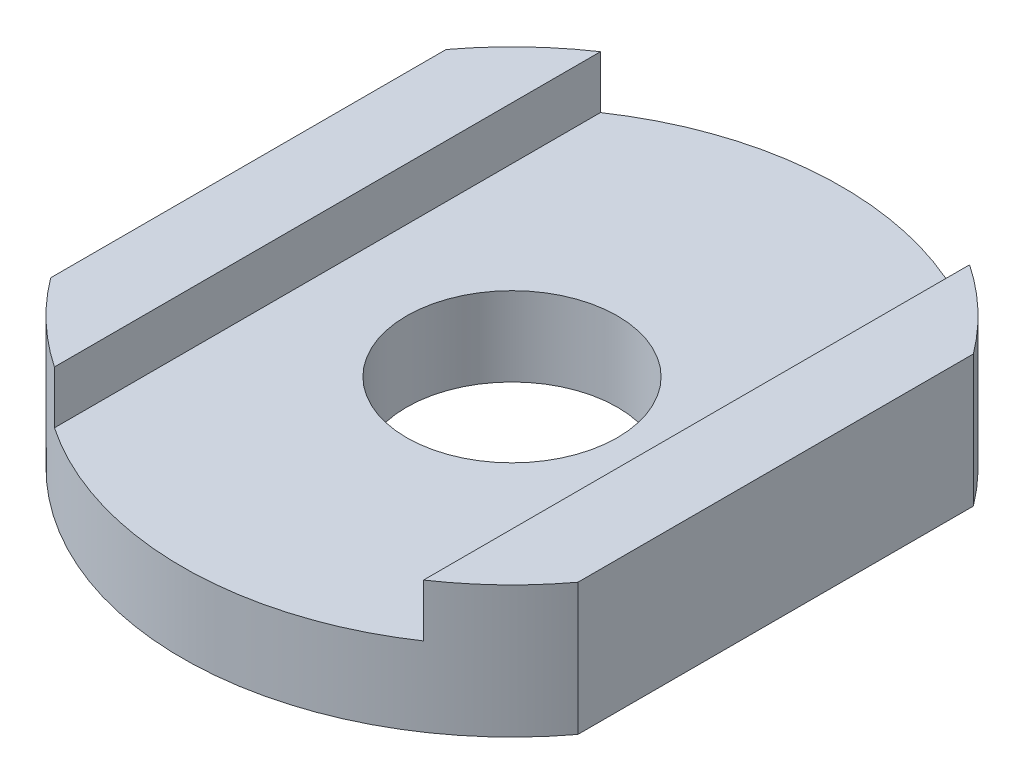
ISO-10303-21;
HEADER;
FILE_DESCRIPTION(('STEP AP214'),'2;1');
FILE_NAME('part.step','',(''),(''),'','','');
FILE_SCHEMA(('AUTOMOTIVE_DESIGN { 1 0 10303 214 1 1 1 1 }'));
ENDSEC;
DATA;
#1=APPLICATION_CONTEXT('core data for automotive mechanical design processes');
#2=APPLICATION_PROTOCOL_DEFINITION('international standard','automotive_design',2000,#1);
#3=PRODUCT_CONTEXT('',#1,'mechanical');
#4=PRODUCT('Part','Part','',(#3));
#5=PRODUCT_RELATED_PRODUCT_CATEGORY('part','',(#4));
#6=PRODUCT_DEFINITION_FORMATION('','',#4);
#7=PRODUCT_DEFINITION_CONTEXT('part definition',#1,'design');
#8=PRODUCT_DEFINITION('design','',#6,#7);
#9=PRODUCT_DEFINITION_SHAPE('','',#8);
#10=(LENGTH_UNIT() NAMED_UNIT(*) SI_UNIT(.MILLI.,.METRE.));
#11=(NAMED_UNIT(*) PLANE_ANGLE_UNIT() SI_UNIT($,.RADIAN.));
#12=(NAMED_UNIT(*) SI_UNIT($,.STERADIAN.) SOLID_ANGLE_UNIT());
#13=UNCERTAINTY_MEASURE_WITH_UNIT(LENGTH_MEASURE(1.E-05),#10,'distance_accuracy_value','');
#14=(GEOMETRIC_REPRESENTATION_CONTEXT(3) GLOBAL_UNCERTAINTY_ASSIGNED_CONTEXT((#13)) GLOBAL_UNIT_ASSIGNED_CONTEXT((#10,
#11,#12)) REPRESENTATION_CONTEXT('',''));
#15=CARTESIAN_POINT('',(0.,0.,0.));
#16=DIRECTION('',(0.,0.,1.));
#17=DIRECTION('',(1.,0.,0.));
#18=AXIS2_PLACEMENT_3D('',#15,#16,#17);
#19=CARTESIAN_POINT('',(0.,3.,0.));
#20=DIRECTION('',(0.,1.,0.));
#21=DIRECTION('',(0.,0.,1.));
#22=AXIS2_PLACEMENT_3D('',#19,#20,#21);
#23=PLANE('',#22);
#24=CARTESIAN_POINT('',(0.,3.,0.));
#25=DIRECTION('',(0.,1.,0.));
#26=DIRECTION('',(0.,0.,1.));
#27=AXIS2_PLACEMENT_3D('',#24,#25,#26);
#28=CIRCLE('',#27,4.);
#29=CARTESIAN_POINT('',(0.,3.,4.));
#30=VERTEX_POINT('',#29);
#31=EDGE_CURVE('E149',#30,#30,#28,.T.);
#32=ORIENTED_EDGE('',*,*,#31,.F.);
#33=EDGE_LOOP('',(#32));
#34=FACE_BOUND('',#33,.T.);
#35=CARTESIAN_POINT('',(0.,3.,0.));
#36=DIRECTION('',(0.,1.,0.));
#37=DIRECTION('',(0.,0.,1.));
#38=AXIS2_PLACEMENT_3D('',#35,#36,#37);
#39=CIRCLE('',#38,12.5);
#40=CARTESIAN_POINT('',(-7.,3.,10.356157588604));
#41=VERTEX_POINT('',#40);
#42=CARTESIAN_POINT('',(7.,3.,10.356157588604));
#43=VERTEX_POINT('',#42);
#44=EDGE_CURVE('E59',#41,#43,#39,.T.);
#45=ORIENTED_EDGE('',*,*,#44,.T.);
#46=DIRECTION('',(0.,0.,1.));
#47=VECTOR('',#46,1.);
#48=CARTESIAN_POINT('',(7.,3.,0.));
#49=LINE('',#48,#47);
#50=CARTESIAN_POINT('',(7.,3.,-10.356157588604));
#51=VERTEX_POINT('',#50);
#52=EDGE_CURVE('E54',#51,#43,#49,.T.);
#53=ORIENTED_EDGE('',*,*,#52,.F.);
#54=CARTESIAN_POINT('',(0.,3.,0.));
#55=DIRECTION('',(0.,1.,0.));
#56=DIRECTION('',(0.,0.,1.));
#57=AXIS2_PLACEMENT_3D('',#54,#55,#56);
#58=CIRCLE('',#57,12.5);
#59=CARTESIAN_POINT('',(-7.,3.,-10.356157588604));
#60=VERTEX_POINT('',#59);
#61=EDGE_CURVE('E126',#51,#60,#58,.T.);
#62=ORIENTED_EDGE('',*,*,#61,.T.);
#63=DIRECTION('',(0.,0.,1.));
#64=VECTOR('',#63,1.);
#65=CARTESIAN_POINT('',(-7.,3.,0.));
#66=LINE('',#65,#64);
#67=EDGE_CURVE('E127',#60,#41,#66,.T.);
#68=ORIENTED_EDGE('',*,*,#67,.T.);
#69=EDGE_LOOP('',(#45,#53,#62,#68));
#70=FACE_BOUND('',#69,.T.);
#71=ADVANCED_FACE('F39',(#34,#70),#23,.T.);
#72=CARTESIAN_POINT('',(0.,0.,0.));
#73=DIRECTION('',(0.,1.,0.));
#74=DIRECTION('',(0.,0.,1.));
#75=AXIS2_PLACEMENT_3D('',#72,#73,#74);
#76=PLANE('',#75);
#77=CARTESIAN_POINT('',(0.,0.,0.));
#78=DIRECTION('',(0.,1.,0.));
#79=DIRECTION('',(0.,0.,1.));
#80=AXIS2_PLACEMENT_3D('',#77,#78,#79);
#81=CIRCLE('',#80,12.5);
#82=CARTESIAN_POINT('',(10.,0.,-7.5));
#83=VERTEX_POINT('',#82);
#84=CARTESIAN_POINT('',(-10.,0.,-7.5));
#85=VERTEX_POINT('',#84);
#86=EDGE_CURVE('E152',#83,#85,#81,.T.);
#87=ORIENTED_EDGE('',*,*,#86,.F.);
#88=DIRECTION('',(0.,0.,-1.));
#89=VECTOR('',#88,1.);
#90=CARTESIAN_POINT('',(10.,0.,-7.5));
#91=LINE('',#90,#89);
#92=CARTESIAN_POINT('',(10.,0.,7.5));
#93=VERTEX_POINT('',#92);
#94=EDGE_CURVE('E156',#93,#83,#91,.T.);
#95=ORIENTED_EDGE('',*,*,#94,.F.);
#96=CARTESIAN_POINT('',(0.,0.,0.));
#97=DIRECTION('',(0.,1.,0.));
#98=DIRECTION('',(0.,0.,1.));
#99=AXIS2_PLACEMENT_3D('',#96,#97,#98);
#100=CIRCLE('',#99,12.5);
#101=CARTESIAN_POINT('',(-10.,0.,7.5));
#102=VERTEX_POINT('',#101);
#103=EDGE_CURVE('E162',#102,#93,#100,.T.);
#104=ORIENTED_EDGE('',*,*,#103,.F.);
#105=DIRECTION('',(0.,0.,1.));
#106=VECTOR('',#105,1.);
#107=CARTESIAN_POINT('',(-10.,0.,-7.5));
#108=LINE('',#107,#106);
#109=EDGE_CURVE('E160',#85,#102,#108,.T.);
#110=ORIENTED_EDGE('',*,*,#109,.F.);
#111=EDGE_LOOP('',(#87,#95,#104,#110));
#112=FACE_BOUND('',#111,.T.);
#113=CARTESIAN_POINT('',(0.,0.,0.));
#114=DIRECTION('',(0.,1.,0.));
#115=DIRECTION('',(0.,0.,1.));
#116=AXIS2_PLACEMENT_3D('',#113,#114,#115);
#117=CIRCLE('',#116,4.);
#118=CARTESIAN_POINT('',(0.,0.,4.));
#119=VERTEX_POINT('',#118);
#120=EDGE_CURVE('E148',#119,#119,#117,.T.);
#121=ORIENTED_EDGE('',*,*,#120,.T.);
#122=EDGE_LOOP('',(#121));
#123=FACE_BOUND('',#122,.T.);
#124=ADVANCED_FACE('F179',(#112,#123),#76,.F.);
#125=CARTESIAN_POINT('',(0.,3.,0.));
#126=DIRECTION('',(0.,-1.,0.));
#127=DIRECTION('',(0.,0.,-1.));
#128=AXIS2_PLACEMENT_3D('',#125,#126,#127);
#129=CYLINDRICAL_SURFACE('',#128,12.5);
#130=ORIENTED_EDGE('',*,*,#86,.T.);
#131=DIRECTION('',(0.,-1.,0.));
#132=VECTOR('',#131,1.);
#133=CARTESIAN_POINT('',(-10.,3.,-7.5));
#134=LINE('',#133,#132);
#135=CARTESIAN_POINT('',(-10.,5.,-7.5));
#136=VERTEX_POINT('',#135);
#137=EDGE_CURVE('E11',#136,#85,#134,.T.);
#138=ORIENTED_EDGE('',*,*,#137,.F.);
#139=CARTESIAN_POINT('',(0.,5.,0.));
#140=DIRECTION('',(0.,1.,0.));
#141=DIRECTION('',(0.,0.,1.));
#142=AXIS2_PLACEMENT_3D('',#139,#140,#141);
#143=CIRCLE('',#142,12.5);
#144=CARTESIAN_POINT('',(-7.,5.,-10.356157588604));
#145=VERTEX_POINT('',#144);
#146=EDGE_CURVE('E136',#145,#136,#143,.T.);
#147=ORIENTED_EDGE('',*,*,#146,.F.);
#148=DIRECTION('',(0.,-1.,0.));
#149=VECTOR('',#148,1.);
#150=CARTESIAN_POINT('',(-7.,5.,-10.356157588604));
#151=LINE('',#150,#149);
#152=EDGE_CURVE('E146',#145,#60,#151,.T.);
#153=ORIENTED_EDGE('',*,*,#152,.T.);
#154=ORIENTED_EDGE('',*,*,#61,.F.);
#155=DIRECTION('',(0.,-1.,0.));
#156=VECTOR('',#155,1.);
#157=CARTESIAN_POINT('',(7.,5.,-10.356157588604));
#158=LINE('',#157,#156);
#159=CARTESIAN_POINT('',(7.,5.,-10.356157588604));
#160=VERTEX_POINT('',#159);
#161=EDGE_CURVE('E107',#160,#51,#158,.T.);
#162=ORIENTED_EDGE('',*,*,#161,.F.);
#163=CARTESIAN_POINT('',(0.,5.,0.));
#164=DIRECTION('',(0.,1.,0.));
#165=DIRECTION('',(0.,0.,1.));
#166=AXIS2_PLACEMENT_3D('',#163,#164,#165);
#167=CIRCLE('',#166,12.5);
#168=CARTESIAN_POINT('',(10.,5.,-7.5));
#169=VERTEX_POINT('',#168);
#170=EDGE_CURVE('E114',#169,#160,#167,.T.);
#171=ORIENTED_EDGE('',*,*,#170,.F.);
#172=DIRECTION('',(0.,-1.,0.));
#173=VECTOR('',#172,1.);
#174=CARTESIAN_POINT('',(10.,3.,-7.5));
#175=LINE('',#174,#173);
#176=EDGE_CURVE('E158',#169,#83,#175,.T.);
#177=ORIENTED_EDGE('',*,*,#176,.T.);
#178=EDGE_LOOP('',(#130,#138,#147,#153,#154,#162,#171,#177));
#179=FACE_BOUND('',#178,.T.);
#180=ADVANCED_FACE('F41',(#179),#129,.T.);
#181=CARTESIAN_POINT('',(-10.,3.,-7.5));
#182=DIRECTION('',(1.,0.,0.));
#183=DIRECTION('',(0.,0.,-1.));
#184=AXIS2_PLACEMENT_3D('',#181,#182,#183);
#185=PLANE('',#184);
#186=ORIENTED_EDGE('',*,*,#109,.T.);
#187=DIRECTION('',(0.,-1.,0.));
#188=VECTOR('',#187,1.);
#189=CARTESIAN_POINT('',(-10.,3.,7.5));
#190=LINE('',#189,#188);
#191=CARTESIAN_POINT('',(-10.,5.,7.5));
#192=VERTEX_POINT('',#191);
#193=EDGE_CURVE('E47',#192,#102,#190,.T.);
#194=ORIENTED_EDGE('',*,*,#193,.F.);
#195=DIRECTION('',(0.,0.,1.));
#196=VECTOR('',#195,1.);
#197=CARTESIAN_POINT('',(-10.,5.,0.));
#198=LINE('',#197,#196);
#199=EDGE_CURVE('E139',#136,#192,#198,.T.);
#200=ORIENTED_EDGE('',*,*,#199,.F.);
#201=ORIENTED_EDGE('',*,*,#137,.T.);
#202=EDGE_LOOP('',(#186,#194,#200,#201));
#203=FACE_BOUND('',#202,.T.);
#204=ADVANCED_FACE('F187',(#203),#185,.F.);
#205=CARTESIAN_POINT('',(0.,3.,0.));
#206=DIRECTION('',(0.,-1.,0.));
#207=DIRECTION('',(0.,0.,-1.));
#208=AXIS2_PLACEMENT_3D('',#205,#206,#207);
#209=CYLINDRICAL_SURFACE('',#208,12.5);
#210=ORIENTED_EDGE('',*,*,#103,.T.);
#211=DIRECTION('',(0.,-1.,0.));
#212=VECTOR('',#211,1.);
#213=CARTESIAN_POINT('',(10.,3.,7.5));
#214=LINE('',#213,#212);
#215=CARTESIAN_POINT('',(10.,5.,7.5));
#216=VERTEX_POINT('',#215);
#217=EDGE_CURVE('E166',#216,#93,#214,.T.);
#218=ORIENTED_EDGE('',*,*,#217,.F.);
#219=CARTESIAN_POINT('',(0.,5.,0.));
#220=DIRECTION('',(0.,1.,0.));
#221=DIRECTION('',(0.,0.,1.));
#222=AXIS2_PLACEMENT_3D('',#219,#220,#221);
#223=CIRCLE('',#222,12.5);
#224=CARTESIAN_POINT('',(7.,5.,10.356157588604));
#225=VERTEX_POINT('',#224);
#226=EDGE_CURVE('E113',#225,#216,#223,.T.);
#227=ORIENTED_EDGE('',*,*,#226,.F.);
#228=DIRECTION('',(0.,-1.,0.));
#229=VECTOR('',#228,1.);
#230=CARTESIAN_POINT('',(7.,5.,10.356157588604));
#231=LINE('',#230,#229);
#232=EDGE_CURVE('E109',#225,#43,#231,.T.);
#233=ORIENTED_EDGE('',*,*,#232,.T.);
#234=ORIENTED_EDGE('',*,*,#44,.F.);
#235=DIRECTION('',(0.,-1.,0.));
#236=VECTOR('',#235,1.);
#237=CARTESIAN_POINT('',(-7.,5.,10.356157588604));
#238=LINE('',#237,#236);
#239=CARTESIAN_POINT('',(-7.,5.,10.356157588604));
#240=VERTEX_POINT('',#239);
#241=EDGE_CURVE('E143',#240,#41,#238,.T.);
#242=ORIENTED_EDGE('',*,*,#241,.F.);
#243=CARTESIAN_POINT('',(0.,5.,0.));
#244=DIRECTION('',(0.,1.,0.));
#245=DIRECTION('',(0.,0.,1.));
#246=AXIS2_PLACEMENT_3D('',#243,#244,#245);
#247=CIRCLE('',#246,12.5);
#248=EDGE_CURVE('E142',#192,#240,#247,.T.);
#249=ORIENTED_EDGE('',*,*,#248,.F.);
#250=ORIENTED_EDGE('',*,*,#193,.T.);
#251=EDGE_LOOP('',(#210,#218,#227,#233,#234,#242,#249,#250));
#252=FACE_BOUND('',#251,.T.);
#253=ADVANCED_FACE('F172',(#252),#209,.T.);
#254=CARTESIAN_POINT('',(10.,3.,-7.5));
#255=DIRECTION('',(-1.,0.,0.));
#256=DIRECTION('',(0.,0.,1.));
#257=AXIS2_PLACEMENT_3D('',#254,#255,#256);
#258=PLANE('',#257);
#259=ORIENTED_EDGE('',*,*,#94,.T.);
#260=ORIENTED_EDGE('',*,*,#176,.F.);
#261=DIRECTION('',(0.,0.,-1.));
#262=VECTOR('',#261,1.);
#263=CARTESIAN_POINT('',(10.,5.,0.));
#264=LINE('',#263,#262);
#265=EDGE_CURVE('E120',#216,#169,#264,.T.);
#266=ORIENTED_EDGE('',*,*,#265,.F.);
#267=ORIENTED_EDGE('',*,*,#217,.T.);
#268=EDGE_LOOP('',(#259,#260,#266,#267));
#269=FACE_BOUND('',#268,.T.);
#270=ADVANCED_FACE('F182',(#269),#258,.F.);
#271=CARTESIAN_POINT('',(0.,3.,0.));
#272=DIRECTION('',(0.,-1.,0.));
#273=DIRECTION('',(0.,0.,-1.));
#274=AXIS2_PLACEMENT_3D('',#271,#272,#273);
#275=CYLINDRICAL_SURFACE('',#274,4.);
#276=ORIENTED_EDGE('',*,*,#31,.T.);
#277=EDGE_LOOP('',(#276));
#278=FACE_BOUND('',#277,.T.);
#279=ORIENTED_EDGE('',*,*,#120,.F.);
#280=EDGE_LOOP('',(#279));
#281=FACE_BOUND('',#280,.T.);
#282=ADVANCED_FACE('F203',(#278,#281),#275,.F.);
#283=CARTESIAN_POINT('',(-7.,5.,0.));
#284=DIRECTION('',(1.,0.,0.));
#285=DIRECTION('',(0.,0.,-1.));
#286=AXIS2_PLACEMENT_3D('',#283,#284,#285);
#287=PLANE('',#286);
#288=ORIENTED_EDGE('',*,*,#67,.F.);
#289=ORIENTED_EDGE('',*,*,#152,.F.);
#290=DIRECTION('',(0.,0.,1.));
#291=VECTOR('',#290,1.);
#292=CARTESIAN_POINT('',(-7.,5.,0.));
#293=LINE('',#292,#291);
#294=EDGE_CURVE('E129',#145,#240,#293,.T.);
#295=ORIENTED_EDGE('',*,*,#294,.T.);
#296=ORIENTED_EDGE('',*,*,#241,.T.);
#297=EDGE_LOOP('',(#288,#289,#295,#296));
#298=FACE_BOUND('',#297,.T.);
#299=ADVANCED_FACE('F210',(#298),#287,.T.);
#300=CARTESIAN_POINT('',(0.,5.,0.));
#301=DIRECTION('',(0.,1.,0.));
#302=DIRECTION('',(0.,0.,1.));
#303=AXIS2_PLACEMENT_3D('',#300,#301,#302);
#304=PLANE('',#303);
#305=ORIENTED_EDGE('',*,*,#294,.F.);
#306=ORIENTED_EDGE('',*,*,#146,.T.);
#307=ORIENTED_EDGE('',*,*,#199,.T.);
#308=ORIENTED_EDGE('',*,*,#248,.T.);
#309=EDGE_LOOP('',(#305,#306,#307,#308));
#310=FACE_BOUND('',#309,.T.);
#311=ADVANCED_FACE('F186',(#310),#304,.T.);
#312=CARTESIAN_POINT('',(7.,5.,0.));
#313=DIRECTION('',(1.,0.,0.));
#314=DIRECTION('',(0.,0.,-1.));
#315=AXIS2_PLACEMENT_3D('',#312,#313,#314);
#316=PLANE('',#315);
#317=ORIENTED_EDGE('',*,*,#52,.T.);
#318=ORIENTED_EDGE('',*,*,#232,.F.);
#319=DIRECTION('',(0.,0.,1.));
#320=VECTOR('',#319,1.);
#321=CARTESIAN_POINT('',(7.,5.,0.));
#322=LINE('',#321,#320);
#323=EDGE_CURVE('E103',#160,#225,#322,.T.);
#324=ORIENTED_EDGE('',*,*,#323,.F.);
#325=ORIENTED_EDGE('',*,*,#161,.T.);
#326=EDGE_LOOP('',(#317,#318,#324,#325));
#327=FACE_BOUND('',#326,.T.);
#328=ADVANCED_FACE('F105',(#327),#316,.F.);
#329=CARTESIAN_POINT('',(0.,5.,0.));
#330=DIRECTION('',(0.,1.,0.));
#331=DIRECTION('',(0.,0.,1.));
#332=AXIS2_PLACEMENT_3D('',#329,#330,#331);
#333=PLANE('',#332);
#334=ORIENTED_EDGE('',*,*,#170,.T.);
#335=ORIENTED_EDGE('',*,*,#323,.T.);
#336=ORIENTED_EDGE('',*,*,#226,.T.);
#337=ORIENTED_EDGE('',*,*,#265,.T.);
#338=EDGE_LOOP('',(#334,#335,#336,#337));
#339=FACE_BOUND('',#338,.T.);
#340=ADVANCED_FACE('F118',(#339),#333,.T.);
#341=CLOSED_SHELL('',(#71,#124,#180,#204,#253,#270,#282,#299,#311,#328,#340));
#342=MANIFOLD_SOLID_BREP('B2',#341);
#343=ADVANCED_BREP_SHAPE_REPRESENTATION('',(#18,#342),#14);
#344=SHAPE_DEFINITION_REPRESENTATION(#9,#343);
ENDSEC;
END-ISO-10303-21;
